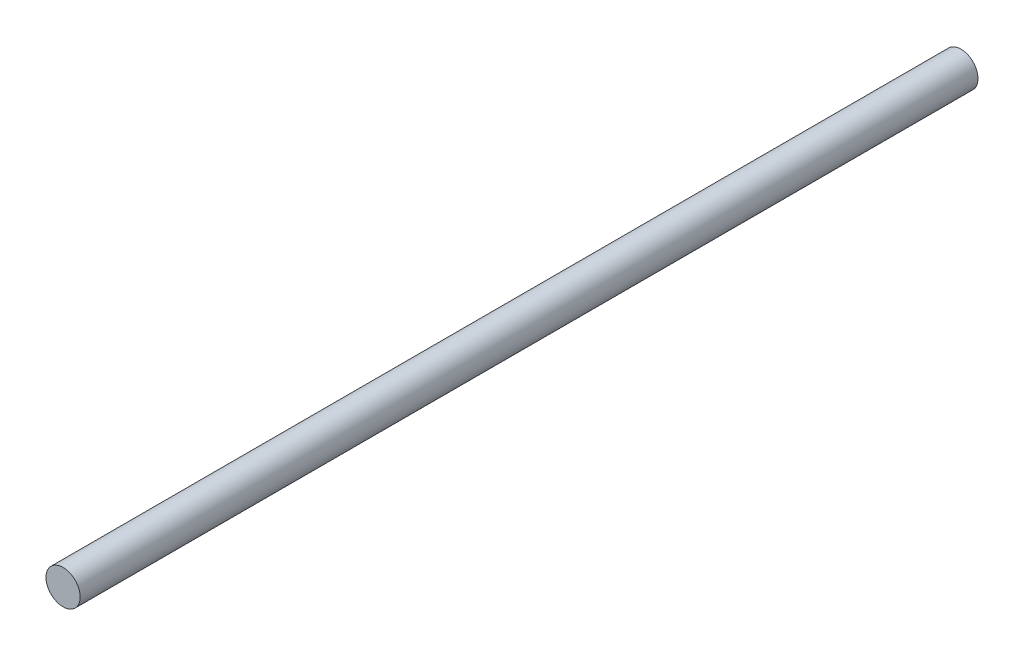
ISO-10303-21;
HEADER;
FILE_DESCRIPTION(('STEP AP214'),'2;1');
FILE_NAME('part.step','',(''),(''),'','','');
FILE_SCHEMA(('AUTOMOTIVE_DESIGN { 1 0 10303 214 1 1 1 1 }'));
ENDSEC;
DATA;
#1=APPLICATION_CONTEXT('core data for automotive mechanical design processes');
#2=APPLICATION_PROTOCOL_DEFINITION('international standard','automotive_design',2000,#1);
#3=PRODUCT_CONTEXT('',#1,'mechanical');
#4=PRODUCT('Part','Part','',(#3));
#5=PRODUCT_RELATED_PRODUCT_CATEGORY('part','',(#4));
#6=PRODUCT_DEFINITION_FORMATION('','',#4);
#7=PRODUCT_DEFINITION_CONTEXT('part definition',#1,'design');
#8=PRODUCT_DEFINITION('design','',#6,#7);
#9=PRODUCT_DEFINITION_SHAPE('','',#8);
#10=(LENGTH_UNIT() NAMED_UNIT(*) SI_UNIT(.MILLI.,.METRE.));
#11=(NAMED_UNIT(*) PLANE_ANGLE_UNIT() SI_UNIT($,.RADIAN.));
#12=(NAMED_UNIT(*) SI_UNIT($,.STERADIAN.) SOLID_ANGLE_UNIT());
#13=UNCERTAINTY_MEASURE_WITH_UNIT(LENGTH_MEASURE(1.E-05),#10,'distance_accuracy_value','');
#14=(GEOMETRIC_REPRESENTATION_CONTEXT(3) GLOBAL_UNCERTAINTY_ASSIGNED_CONTEXT((#13)) GLOBAL_UNIT_ASSIGNED_CONTEXT((#10,
#11,#12)) REPRESENTATION_CONTEXT('',''));
#15=CARTESIAN_POINT('',(0.,0.,0.));
#16=DIRECTION('',(0.,0.,1.));
#17=DIRECTION('',(1.,0.,0.));
#18=AXIS2_PLACEMENT_3D('',#15,#16,#17);
#19=CARTESIAN_POINT('',(0.,0.,210.));
#20=DIRECTION('',(0.,0.,-1.));
#21=DIRECTION('',(-1.,0.,0.));
#22=AXIS2_PLACEMENT_3D('',#19,#20,#21);
#23=CYLINDRICAL_SURFACE('',#22,4.);
#24=CARTESIAN_POINT('',(0.,0.,210.));
#25=DIRECTION('',(0.,0.,1.));
#26=DIRECTION('',(1.,0.,0.));
#27=AXIS2_PLACEMENT_3D('',#24,#25,#26);
#28=CIRCLE('',#27,4.);
#29=CARTESIAN_POINT('',(4.,0.,210.));
#30=VERTEX_POINT('',#29);
#31=EDGE_CURVE('E10',#30,#30,#28,.T.);
#32=ORIENTED_EDGE('',*,*,#31,.F.);
#33=EDGE_LOOP('',(#32));
#34=FACE_BOUND('',#33,.T.);
#35=CARTESIAN_POINT('',(0.,0.,0.));
#36=DIRECTION('',(0.,0.,1.));
#37=DIRECTION('',(1.,0.,0.));
#38=AXIS2_PLACEMENT_3D('',#35,#36,#37);
#39=CIRCLE('',#38,4.);
#40=CARTESIAN_POINT('',(4.,0.,0.));
#41=VERTEX_POINT('',#40);
#42=EDGE_CURVE('E46',#41,#41,#39,.T.);
#43=ORIENTED_EDGE('',*,*,#42,.T.);
#44=EDGE_LOOP('',(#43));
#45=FACE_BOUND('',#44,.T.);
#46=ADVANCED_FACE('F43',(#34,#45),#23,.T.);
#47=CARTESIAN_POINT('',(0.,0.,210.));
#48=DIRECTION('',(0.,0.,1.));
#49=DIRECTION('',(1.,0.,0.));
#50=AXIS2_PLACEMENT_3D('',#47,#48,#49);
#51=PLANE('',#50);
#52=ORIENTED_EDGE('',*,*,#31,.T.);
#53=EDGE_LOOP('',(#52));
#54=FACE_BOUND('',#53,.T.);
#55=ADVANCED_FACE('F60',(#54),#51,.T.);
#56=CARTESIAN_POINT('',(0.,0.,0.));
#57=DIRECTION('',(0.,0.,1.));
#58=DIRECTION('',(1.,0.,0.));
#59=AXIS2_PLACEMENT_3D('',#56,#57,#58);
#60=PLANE('',#59);
#61=ORIENTED_EDGE('',*,*,#42,.F.);
#62=EDGE_LOOP('',(#61));
#63=FACE_BOUND('',#62,.T.);
#64=ADVANCED_FACE('F58',(#63),#60,.F.);
#65=CLOSED_SHELL('',(#46,#55,#64));
#66=MANIFOLD_SOLID_BREP('B2',#65);
#67=ADVANCED_BREP_SHAPE_REPRESENTATION('',(#18,#66),#14);
#68=SHAPE_DEFINITION_REPRESENTATION(#9,#67);
ENDSEC;
END-ISO-10303-21;
